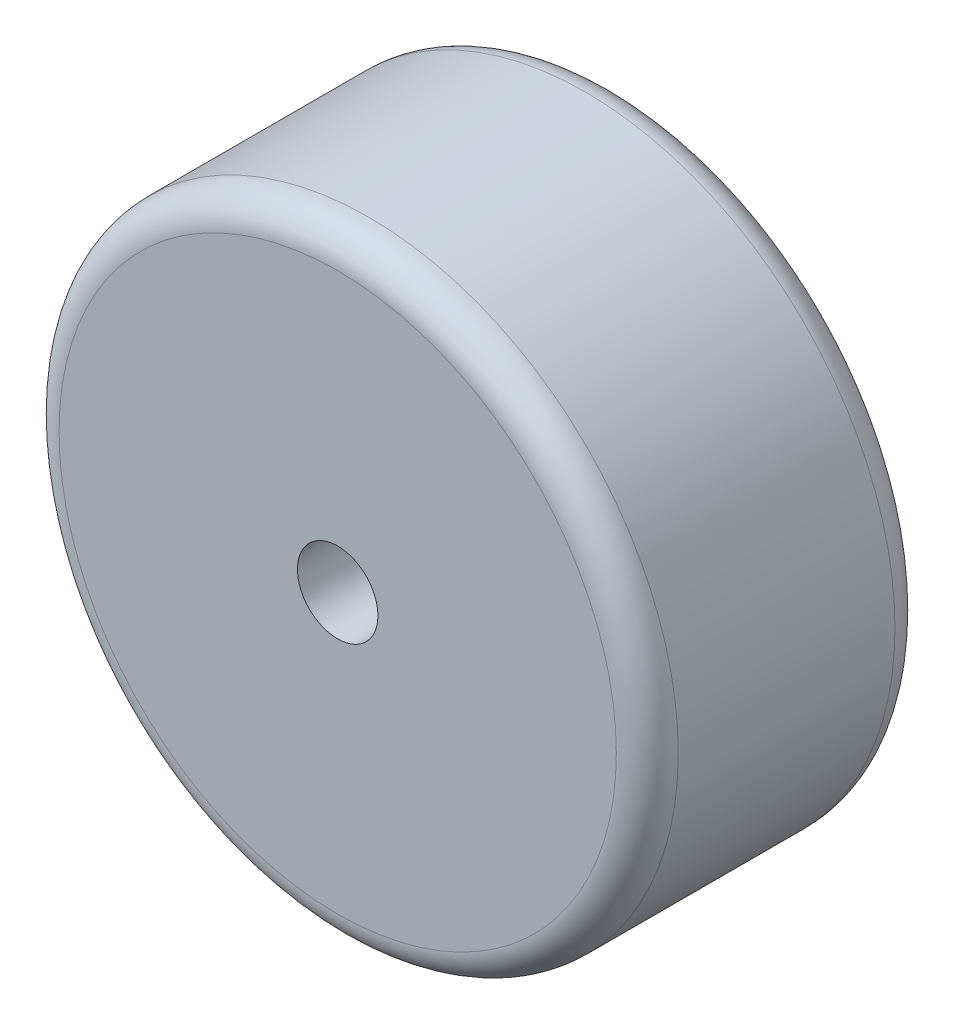
ISO-10303-21;
HEADER;
FILE_DESCRIPTION(('STEP AP214'),'2;1');
FILE_NAME('part.step','',(''),(''),'','','');
FILE_SCHEMA(('AUTOMOTIVE_DESIGN { 1 0 10303 214 1 1 1 1 }'));
ENDSEC;
DATA;
#1=APPLICATION_CONTEXT('core data for automotive mechanical design processes');
#2=APPLICATION_PROTOCOL_DEFINITION('international standard','automotive_design',2000,#1);
#3=PRODUCT_CONTEXT('',#1,'mechanical');
#4=PRODUCT('Part','Part','',(#3));
#5=PRODUCT_RELATED_PRODUCT_CATEGORY('part','',(#4));
#6=PRODUCT_DEFINITION_FORMATION('','',#4);
#7=PRODUCT_DEFINITION_CONTEXT('part definition',#1,'design');
#8=PRODUCT_DEFINITION('design','',#6,#7);
#9=PRODUCT_DEFINITION_SHAPE('','',#8);
#10=(LENGTH_UNIT() NAMED_UNIT(*) SI_UNIT(.MILLI.,.METRE.));
#11=(NAMED_UNIT(*) PLANE_ANGLE_UNIT() SI_UNIT($,.RADIAN.));
#12=(NAMED_UNIT(*) SI_UNIT($,.STERADIAN.) SOLID_ANGLE_UNIT());
#13=UNCERTAINTY_MEASURE_WITH_UNIT(LENGTH_MEASURE(1.E-05),#10,'distance_accuracy_value','');
#14=(GEOMETRIC_REPRESENTATION_CONTEXT(3) GLOBAL_UNCERTAINTY_ASSIGNED_CONTEXT((#13)) GLOBAL_UNIT_ASSIGNED_CONTEXT((#10,
#11,#12)) REPRESENTATION_CONTEXT('',''));
#15=CARTESIAN_POINT('',(0.,0.,0.));
#16=DIRECTION('',(0.,0.,1.));
#17=DIRECTION('',(1.,0.,0.));
#18=AXIS2_PLACEMENT_3D('',#15,#16,#17);
#19=CARTESIAN_POINT('',(0.,0.,4.5));
#20=DIRECTION('',(0.,0.,1.));
#21=DIRECTION('',(1.,0.,0.));
#22=AXIS2_PLACEMENT_3D('',#19,#20,#21);
#23=PLANE('',#22);
#24=CARTESIAN_POINT('',(0.,0.,4.5));
#25=DIRECTION('',(0.,0.,1.));
#26=DIRECTION('',(1.,0.,0.));
#27=AXIS2_PLACEMENT_3D('',#24,#25,#26);
#28=CIRCLE('',#27,4.5);
#29=CARTESIAN_POINT('',(4.5,0.,4.5));
#30=VERTEX_POINT('',#29);
#31=EDGE_CURVE('E10',#30,#30,#28,.T.);
#32=ORIENTED_EDGE('',*,*,#31,.T.);
#33=EDGE_LOOP('',(#32));
#34=FACE_BOUND('',#33,.T.);
#35=CARTESIAN_POINT('',(0.,0.,4.5));
#36=DIRECTION('',(0.,0.,1.));
#37=DIRECTION('',(1.,0.,0.));
#38=AXIS2_PLACEMENT_3D('',#35,#36,#37);
#39=CIRCLE('',#38,0.65);
#40=CARTESIAN_POINT('',(0.65,0.,4.5));
#41=VERTEX_POINT('',#40);
#42=EDGE_CURVE('E50',#41,#41,#39,.T.);
#43=ORIENTED_EDGE('',*,*,#42,.F.);
#44=EDGE_LOOP('',(#43));
#45=FACE_BOUND('',#44,.T.);
#46=ADVANCED_FACE('F30',(#34,#45),#23,.T.);
#47=CARTESIAN_POINT('',(0.,0.,0.));
#48=DIRECTION('',(0.,0.,1.));
#49=DIRECTION('',(1.,0.,0.));
#50=AXIS2_PLACEMENT_3D('',#47,#48,#49);
#51=PLANE('',#50);
#52=CARTESIAN_POINT('',(0.,0.,0.));
#53=DIRECTION('',(0.,0.,1.));
#54=DIRECTION('',(1.,0.,0.));
#55=AXIS2_PLACEMENT_3D('',#52,#53,#54);
#56=CIRCLE('',#55,4.5);
#57=CARTESIAN_POINT('',(4.5,0.,0.));
#58=VERTEX_POINT('',#57);
#59=EDGE_CURVE('E37',#58,#58,#56,.F.);
#60=ORIENTED_EDGE('',*,*,#59,.T.);
#61=EDGE_LOOP('',(#60));
#62=FACE_BOUND('',#61,.T.);
#63=CARTESIAN_POINT('',(0.,0.,0.));
#64=DIRECTION('',(0.,0.,1.));
#65=DIRECTION('',(1.,0.,0.));
#66=AXIS2_PLACEMENT_3D('',#63,#64,#65);
#67=CIRCLE('',#66,0.65);
#68=CARTESIAN_POINT('',(0.65,0.,0.));
#69=VERTEX_POINT('',#68);
#70=EDGE_CURVE('E51',#69,#69,#67,.T.);
#71=ORIENTED_EDGE('',*,*,#70,.T.);
#72=EDGE_LOOP('',(#71));
#73=FACE_BOUND('',#72,.T.);
#74=ADVANCED_FACE('F61',(#62,#73),#51,.F.);
#75=CARTESIAN_POINT('',(0.,0.,4.5));
#76=DIRECTION('',(0.,0.,-1.));
#77=DIRECTION('',(-1.,0.,0.));
#78=AXIS2_PLACEMENT_3D('',#75,#76,#77);
#79=CYLINDRICAL_SURFACE('',#78,5.);
#80=CARTESIAN_POINT('',(0.,0.,0.5));
#81=DIRECTION('',(0.,0.,1.));
#82=DIRECTION('',(1.,0.,0.));
#83=AXIS2_PLACEMENT_3D('',#80,#81,#82);
#84=CIRCLE('',#83,5.);
#85=CARTESIAN_POINT('',(5.,0.,0.5));
#86=VERTEX_POINT('',#85);
#87=EDGE_CURVE('E41',#86,#86,#84,.T.);
#88=ORIENTED_EDGE('',*,*,#87,.T.);
#89=EDGE_LOOP('',(#88));
#90=FACE_BOUND('',#89,.T.);
#91=CARTESIAN_POINT('',(0.,0.,4.));
#92=DIRECTION('',(0.,0.,1.));
#93=DIRECTION('',(1.,0.,0.));
#94=AXIS2_PLACEMENT_3D('',#91,#92,#93);
#95=CIRCLE('',#94,5.);
#96=CARTESIAN_POINT('',(5.,0.,4.));
#97=VERTEX_POINT('',#96);
#98=EDGE_CURVE('E45',#97,#97,#95,.F.);
#99=ORIENTED_EDGE('',*,*,#98,.T.);
#100=EDGE_LOOP('',(#99));
#101=FACE_BOUND('',#100,.T.);
#102=ADVANCED_FACE('F66',(#90,#101),#79,.T.);
#103=CARTESIAN_POINT('',(0.,0.,4.5));
#104=DIRECTION('',(0.,0.,-1.));
#105=DIRECTION('',(-1.,0.,0.));
#106=AXIS2_PLACEMENT_3D('',#103,#104,#105);
#107=CYLINDRICAL_SURFACE('',#106,0.65);
#108=ORIENTED_EDGE('',*,*,#42,.T.);
#109=EDGE_LOOP('',(#108));
#110=FACE_BOUND('',#109,.T.);
#111=ORIENTED_EDGE('',*,*,#70,.F.);
#112=EDGE_LOOP('',(#111));
#113=FACE_BOUND('',#112,.T.);
#114=ADVANCED_FACE('F57',(#110,#113),#107,.F.);
#115=CARTESIAN_POINT('',(0.,0.,0.5));
#116=DIRECTION('',(0.,0.,1.));
#117=DIRECTION('',(1.,0.,0.));
#118=AXIS2_PLACEMENT_3D('',#115,#116,#117);
#119=TOROIDAL_SURFACE('',#118,4.5,0.5);
#120=ORIENTED_EDGE('',*,*,#59,.F.);
#121=EDGE_LOOP('',(#120));
#122=FACE_BOUND('',#121,.T.);
#123=ORIENTED_EDGE('',*,*,#87,.F.);
#124=EDGE_LOOP('',(#123));
#125=FACE_BOUND('',#124,.T.);
#126=ADVANCED_FACE('F72',(#122,#125),#119,.T.);
#127=CARTESIAN_POINT('',(0.,0.,4.));
#128=DIRECTION('',(0.,0.,1.));
#129=DIRECTION('',(1.,0.,0.));
#130=AXIS2_PLACEMENT_3D('',#127,#128,#129);
#131=TOROIDAL_SURFACE('',#130,4.5,0.5);
#132=ORIENTED_EDGE('',*,*,#98,.F.);
#133=EDGE_LOOP('',(#132));
#134=FACE_BOUND('',#133,.T.);
#135=ORIENTED_EDGE('',*,*,#31,.F.);
#136=EDGE_LOOP('',(#135));
#137=FACE_BOUND('',#136,.T.);
#138=ADVANCED_FACE('F32',(#134,#137),#131,.T.);
#139=CLOSED_SHELL('',(#46,#74,#102,#114,#126,#138));
#140=MANIFOLD_SOLID_BREP('B2',#139);
#141=ADVANCED_BREP_SHAPE_REPRESENTATION('',(#18,#140),#14);
#142=SHAPE_DEFINITION_REPRESENTATION(#9,#141);
ENDSEC;
END-ISO-10303-21;
